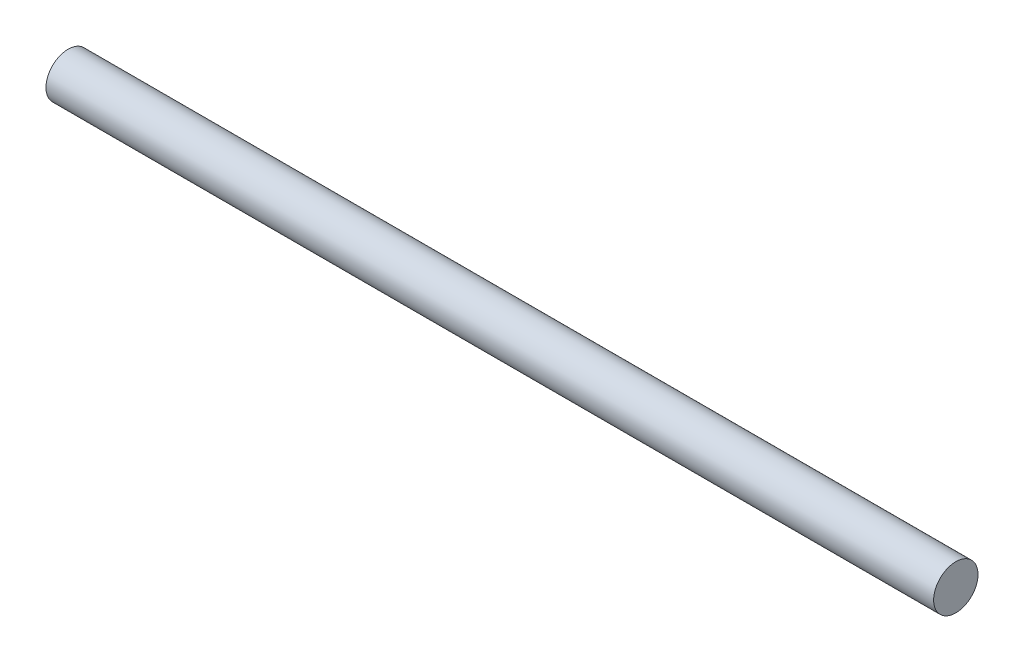
ISO-10303-21;
HEADER;
FILE_DESCRIPTION(('STEP AP214'),'2;1');
FILE_NAME('part.step','',(''),(''),'','','');
FILE_SCHEMA(('AUTOMOTIVE_DESIGN { 1 0 10303 214 1 1 1 1 }'));
ENDSEC;
DATA;
#1=APPLICATION_CONTEXT('core data for automotive mechanical design processes');
#2=APPLICATION_PROTOCOL_DEFINITION('international standard','automotive_design',2000,#1);
#3=PRODUCT_CONTEXT('',#1,'mechanical');
#4=PRODUCT('Part','Part','',(#3));
#5=PRODUCT_RELATED_PRODUCT_CATEGORY('part','',(#4));
#6=PRODUCT_DEFINITION_FORMATION('','',#4);
#7=PRODUCT_DEFINITION_CONTEXT('part definition',#1,'design');
#8=PRODUCT_DEFINITION('design','',#6,#7);
#9=PRODUCT_DEFINITION_SHAPE('','',#8);
#10=(LENGTH_UNIT() NAMED_UNIT(*) SI_UNIT(.MILLI.,.METRE.));
#11=(NAMED_UNIT(*) PLANE_ANGLE_UNIT() SI_UNIT($,.RADIAN.));
#12=(NAMED_UNIT(*) SI_UNIT($,.STERADIAN.) SOLID_ANGLE_UNIT());
#13=UNCERTAINTY_MEASURE_WITH_UNIT(LENGTH_MEASURE(1.E-05),#10,'distance_accuracy_value','');
#14=(GEOMETRIC_REPRESENTATION_CONTEXT(3) GLOBAL_UNCERTAINTY_ASSIGNED_CONTEXT((#13)) GLOBAL_UNIT_ASSIGNED_CONTEXT((#10,
#11,#12)) REPRESENTATION_CONTEXT('',''));
#15=CARTESIAN_POINT('',(0.,0.,0.));
#16=DIRECTION('',(0.,0.,1.));
#17=DIRECTION('',(1.,0.,0.));
#18=AXIS2_PLACEMENT_3D('',#15,#16,#17);
#19=CARTESIAN_POINT('',(100.,0.,0.));
#20=DIRECTION('',(-1.,0.,0.));
#21=DIRECTION('',(0.,0.,1.));
#22=AXIS2_PLACEMENT_3D('',#19,#20,#21);
#23=CYLINDRICAL_SURFACE('',#22,2.5);
#24=CARTESIAN_POINT('',(100.,0.,0.));
#25=DIRECTION('',(1.,0.,0.));
#26=DIRECTION('',(0.,0.,-1.));
#27=AXIS2_PLACEMENT_3D('',#24,#25,#26);
#28=CIRCLE('',#27,2.5);
#29=CARTESIAN_POINT('',(100.,0.,-2.5));
#30=VERTEX_POINT('',#29);
#31=EDGE_CURVE('E10',#30,#30,#28,.T.);
#32=ORIENTED_EDGE('',*,*,#31,.F.);
#33=EDGE_LOOP('',(#32));
#34=FACE_BOUND('',#33,.T.);
#35=CARTESIAN_POINT('',(0.,0.,0.));
#36=DIRECTION('',(1.,0.,0.));
#37=DIRECTION('',(0.,0.,-1.));
#38=AXIS2_PLACEMENT_3D('',#35,#36,#37);
#39=CIRCLE('',#38,2.5);
#40=CARTESIAN_POINT('',(0.,0.,-2.5));
#41=VERTEX_POINT('',#40);
#42=EDGE_CURVE('E34',#41,#41,#39,.T.);
#43=ORIENTED_EDGE('',*,*,#42,.T.);
#44=EDGE_LOOP('',(#43));
#45=FACE_BOUND('',#44,.T.);
#46=ADVANCED_FACE('F31',(#34,#45),#23,.T.);
#47=CARTESIAN_POINT('',(100.,0.,0.));
#48=DIRECTION('',(1.,0.,0.));
#49=DIRECTION('',(0.,0.,-1.));
#50=AXIS2_PLACEMENT_3D('',#47,#48,#49);
#51=PLANE('',#50);
#52=ORIENTED_EDGE('',*,*,#31,.T.);
#53=EDGE_LOOP('',(#52));
#54=FACE_BOUND('',#53,.T.);
#55=ADVANCED_FACE('F46',(#54),#51,.T.);
#56=CARTESIAN_POINT('',(0.,0.,0.));
#57=DIRECTION('',(1.,0.,0.));
#58=DIRECTION('',(0.,0.,-1.));
#59=AXIS2_PLACEMENT_3D('',#56,#57,#58);
#60=PLANE('',#59);
#61=ORIENTED_EDGE('',*,*,#42,.F.);
#62=EDGE_LOOP('',(#61));
#63=FACE_BOUND('',#62,.T.);
#64=ADVANCED_FACE('F44',(#63),#60,.F.);
#65=CLOSED_SHELL('',(#46,#55,#64));
#66=MANIFOLD_SOLID_BREP('B2',#65);
#67=ADVANCED_BREP_SHAPE_REPRESENTATION('',(#18,#66),#14);
#68=SHAPE_DEFINITION_REPRESENTATION(#9,#67);
ENDSEC;
END-ISO-10303-21;
